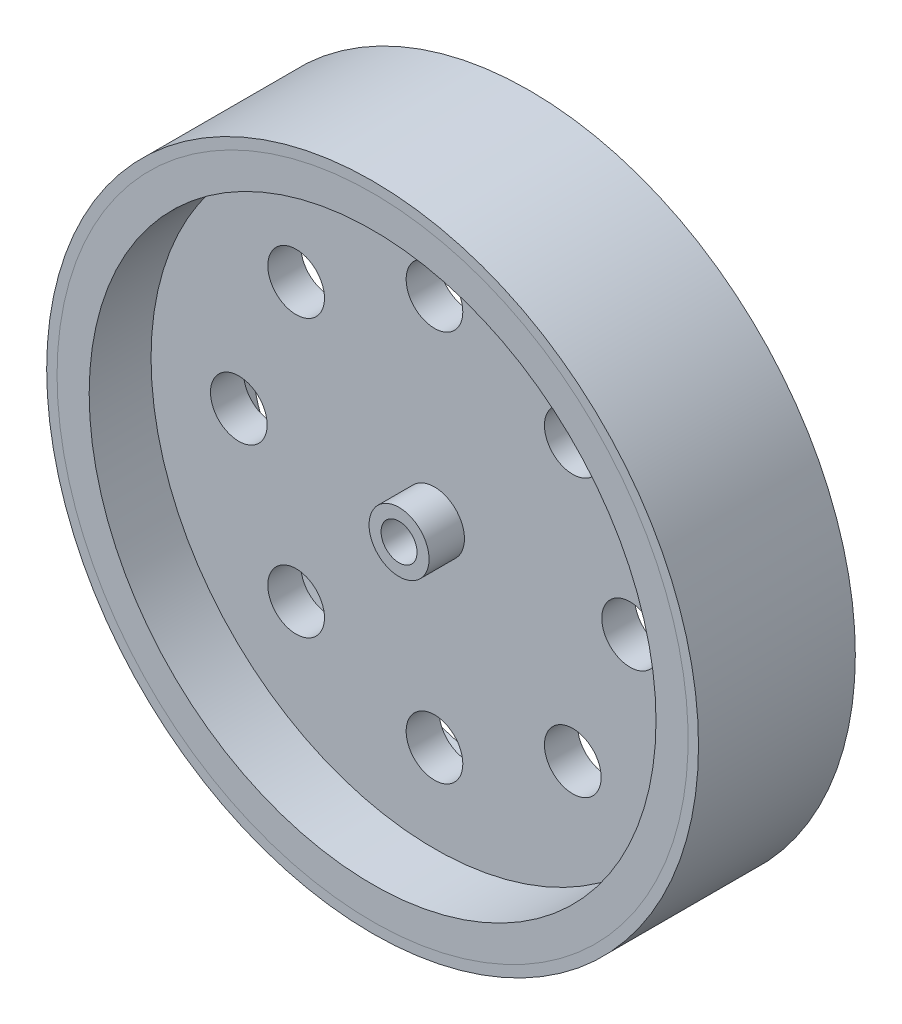
ISO-10303-21;
HEADER;
FILE_DESCRIPTION(('STEP AP214'),'2;1');
FILE_NAME('part.step','',(''),(''),'','','');
FILE_SCHEMA(('AUTOMOTIVE_DESIGN { 1 0 10303 214 1 1 1 1 }'));
ENDSEC;
DATA;
#1=APPLICATION_CONTEXT('core data for automotive mechanical design processes');
#2=APPLICATION_PROTOCOL_DEFINITION('international standard','automotive_design',2000,#1);
#3=PRODUCT_CONTEXT('',#1,'mechanical');
#4=PRODUCT('Part','Part','',(#3));
#5=PRODUCT_RELATED_PRODUCT_CATEGORY('part','',(#4));
#6=PRODUCT_DEFINITION_FORMATION('','',#4);
#7=PRODUCT_DEFINITION_CONTEXT('part definition',#1,'design');
#8=PRODUCT_DEFINITION('design','',#6,#7);
#9=PRODUCT_DEFINITION_SHAPE('','',#8);
#10=(LENGTH_UNIT() NAMED_UNIT(*) SI_UNIT(.MILLI.,.METRE.));
#11=(NAMED_UNIT(*) PLANE_ANGLE_UNIT() SI_UNIT($,.RADIAN.));
#12=(NAMED_UNIT(*) SI_UNIT($,.STERADIAN.) SOLID_ANGLE_UNIT());
#13=UNCERTAINTY_MEASURE_WITH_UNIT(LENGTH_MEASURE(1.E-05),#10,'distance_accuracy_value','');
#14=(GEOMETRIC_REPRESENTATION_CONTEXT(3) GLOBAL_UNCERTAINTY_ASSIGNED_CONTEXT((#13)) GLOBAL_UNIT_ASSIGNED_CONTEXT((#10,
#11,#12)) REPRESENTATION_CONTEXT('',''));
#15=CARTESIAN_POINT('',(0.,0.,0.));
#16=DIRECTION('',(0.,0.,1.));
#17=DIRECTION('',(1.,0.,0.));
#18=AXIS2_PLACEMENT_3D('',#15,#16,#17);
#19=CARTESIAN_POINT('',(0.,0.,1.05));
#20=DIRECTION('',(0.,0.,1.));
#21=DIRECTION('',(1.,0.,0.));
#22=AXIS2_PLACEMENT_3D('',#19,#20,#21);
#23=PLANE('',#22);
#24=CARTESIAN_POINT('',(0.,12.4255368501982,1.05));
#25=DIRECTION('',(0.,0.,1.));
#26=DIRECTION('',(1.,0.,0.));
#27=AXIS2_PLACEMENT_3D('',#24,#25,#26);
#28=CIRCLE('',#27,1.8);
#29=CARTESIAN_POINT('',(1.8,12.4255368501982,1.05));
#30=VERTEX_POINT('',#29);
#31=EDGE_CURVE('E84',#30,#30,#28,.T.);
#32=ORIENTED_EDGE('',*,*,#31,.F.);
#33=EDGE_LOOP('',(#32));
#34=FACE_BOUND('',#33,.T.);
#35=CARTESIAN_POINT('',(-8.78618136665871,8.786181366659,1.05));
#36=DIRECTION('',(0.,0.,1.));
#37=DIRECTION('',(1.,0.,0.));
#38=AXIS2_PLACEMENT_3D('',#35,#36,#37);
#39=CIRCLE('',#38,1.80000000000007);
#40=CARTESIAN_POINT('',(-6.98618136665864,8.786181366659,1.05));
#41=VERTEX_POINT('',#40);
#42=EDGE_CURVE('E88',#41,#41,#39,.T.);
#43=ORIENTED_EDGE('',*,*,#42,.F.);
#44=EDGE_LOOP('',(#43));
#45=FACE_BOUND('',#44,.T.);
#46=CARTESIAN_POINT('',(-12.4255368501989,7.04788306353095E-13,1.05));
#47=DIRECTION('',(0.,0.,1.));
#48=DIRECTION('',(1.,0.,0.));
#49=AXIS2_PLACEMENT_3D('',#46,#47,#48);
#50=CIRCLE('',#49,1.80000000000051);
#51=CARTESIAN_POINT('',(-10.6255368501984,7.04788306353095E-13,1.05));
#52=VERTEX_POINT('',#51);
#53=EDGE_CURVE('E92',#52,#52,#50,.T.);
#54=ORIENTED_EDGE('',*,*,#53,.F.);
#55=EDGE_LOOP('',(#54));
#56=FACE_BOUND('',#55,.T.);
#57=CARTESIAN_POINT('',(-8.78618136665971,-8.78618136665801,1.05));
#58=DIRECTION('',(0.,0.,1.));
#59=DIRECTION('',(1.,0.,0.));
#60=AXIS2_PLACEMENT_3D('',#57,#58,#59);
#61=CIRCLE('',#60,1.80000000000107);
#62=CARTESIAN_POINT('',(-6.98618136665864,-8.78618136665801,1.05));
#63=VERTEX_POINT('',#62);
#64=EDGE_CURVE('E96',#63,#63,#61,.T.);
#65=ORIENTED_EDGE('',*,*,#64,.F.);
#66=EDGE_LOOP('',(#65));
#67=FACE_BOUND('',#66,.T.);
#68=CARTESIAN_POINT('',(-1.40957661270619E-12,-12.4255368501982,1.05));
#69=DIRECTION('',(0.,0.,1.));
#70=DIRECTION('',(1.,0.,0.));
#71=AXIS2_PLACEMENT_3D('',#68,#69,#70);
#72=CIRCLE('',#71,1.80000000000143);
#73=CARTESIAN_POINT('',(1.80000000000002,-12.4255368501982,1.05));
#74=VERTEX_POINT('',#73);
#75=EDGE_CURVE('E100',#74,#74,#72,.T.);
#76=ORIENTED_EDGE('',*,*,#75,.F.);
#77=EDGE_LOOP('',(#76));
#78=FACE_BOUND('',#77,.T.);
#79=CARTESIAN_POINT('',(8.7861813666573,-8.78618136665901,1.05));
#80=DIRECTION('',(0.,0.,1.));
#81=DIRECTION('',(1.,0.,0.));
#82=AXIS2_PLACEMENT_3D('',#79,#80,#81);
#83=CIRCLE('',#82,1.8000000000014);
#84=CARTESIAN_POINT('',(10.5861813666587,-8.78618136665901,1.05));
#85=VERTEX_POINT('',#84);
#86=EDGE_CURVE('E104',#85,#85,#83,.T.);
#87=ORIENTED_EDGE('',*,*,#86,.F.);
#88=EDGE_LOOP('',(#87));
#89=FACE_BOUND('',#88,.T.);
#90=CARTESIAN_POINT('',(12.4255368501975,-7.06309995746223E-13,1.05));
#91=DIRECTION('',(0.,0.,1.));
#92=DIRECTION('',(1.,0.,0.));
#93=AXIS2_PLACEMENT_3D('',#90,#91,#92);
#94=CIRCLE('',#93,1.80000000000101);
#95=CARTESIAN_POINT('',(14.2255368501985,-7.06309995746223E-13,1.05));
#96=VERTEX_POINT('',#95);
#97=EDGE_CURVE('E108',#96,#96,#94,.T.);
#98=ORIENTED_EDGE('',*,*,#97,.F.);
#99=EDGE_LOOP('',(#98));
#100=FACE_BOUND('',#99,.T.);
#101=CARTESIAN_POINT('',(8.7861813666583,8.78618136665801,1.05));
#102=DIRECTION('',(0.,0.,1.));
#103=DIRECTION('',(1.,0.,0.));
#104=AXIS2_PLACEMENT_3D('',#101,#102,#103);
#105=CIRCLE('',#104,1.80000000000049);
#106=CARTESIAN_POINT('',(10.5861813666588,8.78618136665801,1.05));
#107=VERTEX_POINT('',#106);
#108=EDGE_CURVE('E112',#107,#107,#105,.T.);
#109=ORIENTED_EDGE('',*,*,#108,.F.);
#110=EDGE_LOOP('',(#109));
#111=FACE_BOUND('',#110,.T.);
#112=CARTESIAN_POINT('',(0.,0.,1.05));
#113=DIRECTION('',(0.,0.,1.));
#114=DIRECTION('',(1.,0.,0.));
#115=AXIS2_PLACEMENT_3D('',#112,#113,#114);
#116=CIRCLE('',#115,1.143);
#117=CARTESIAN_POINT('',(1.143,0.,1.05));
#118=VERTEX_POINT('',#117);
#119=EDGE_CURVE('E77',#118,#118,#116,.T.);
#120=ORIENTED_EDGE('',*,*,#119,.F.);
#121=EDGE_LOOP('',(#120));
#122=FACE_BOUND('',#121,.T.);
#123=CARTESIAN_POINT('',(0.,0.,1.05));
#124=DIRECTION('',(0.,0.,1.));
#125=DIRECTION('',(1.,0.,0.));
#126=AXIS2_PLACEMENT_3D('',#123,#124,#125);
#127=CIRCLE('',#126,18.);
#128=CARTESIAN_POINT('',(-18.,0.,1.05));
#129=VERTEX_POINT('',#128);
#130=EDGE_CURVE('E57',#129,#129,#127,.F.);
#131=ORIENTED_EDGE('',*,*,#130,.F.);
#132=EDGE_LOOP('',(#131));
#133=FACE_BOUND('',#132,.T.);
#134=ADVANCED_FACE('F48',(#34,#45,#56,#67,#78,#89,#100,#111,#122,#133),#23,.T.);
#135=CARTESIAN_POINT('',(0.,0.,4.98));
#136=DIRECTION('',(0.,0.,-1.));
#137=DIRECTION('',(-1.,0.,0.));
#138=AXIS2_PLACEMENT_3D('',#135,#136,#137);
#139=CYLINDRICAL_SURFACE('',#138,18.);
#140=CARTESIAN_POINT('',(0.,0.,-4.98));
#141=DIRECTION('',(0.,0.,1.));
#142=DIRECTION('',(1.,0.,0.));
#143=AXIS2_PLACEMENT_3D('',#140,#141,#142);
#144=CIRCLE('',#143,18.);
#145=CARTESIAN_POINT('',(-18.,0.,-4.98));
#146=VERTEX_POINT('',#145);
#147=EDGE_CURVE('E73',#146,#146,#144,.T.);
#148=CARTESIAN_POINT('',(0.,0.,-1.05));
#149=DIRECTION('',(0.,0.,1.));
#150=DIRECTION('',(1.,0.,0.));
#151=AXIS2_PLACEMENT_3D('',#148,#149,#150);
#152=CIRCLE('',#151,18.);
#153=CARTESIAN_POINT('',(-18.,0.,-1.05));
#154=VERTEX_POINT('',#153);
#155=EDGE_CURVE('E11',#154,#154,#152,.T.);
#156=CARTESIAN_POINT('',(-18.,0.,-4.98));
#157=CARTESIAN_POINT('',(-18.,0.,-4.9390625));
#158=CARTESIAN_POINT('',(-18.,0.,-4.898125));
#159=CARTESIAN_POINT('',(-18.,0.,-4.81625));
#160=CARTESIAN_POINT('',(-18.,0.,-4.7753125));
#161=CARTESIAN_POINT('',(-18.,0.,-4.6934375));
#162=CARTESIAN_POINT('',(-18.,0.,-4.6525));
#163=CARTESIAN_POINT('',(-18.,0.,-4.570625));
#164=CARTESIAN_POINT('',(-18.,0.,-4.5296875));
#165=CARTESIAN_POINT('',(-18.,0.,-4.4478125));
#166=CARTESIAN_POINT('',(-18.,0.,-4.406875));
#167=CARTESIAN_POINT('',(-18.,0.,-4.325));
#168=CARTESIAN_POINT('',(-18.,0.,-4.2840625));
#169=CARTESIAN_POINT('',(-18.,0.,-4.2021875));
#170=CARTESIAN_POINT('',(-18.,0.,-4.16125));
#171=CARTESIAN_POINT('',(-18.,0.,-4.079375));
#172=CARTESIAN_POINT('',(-18.,0.,-4.0384375));
#173=CARTESIAN_POINT('',(-18.,0.,-3.9565625));
#174=CARTESIAN_POINT('',(-18.,0.,-3.915625));
#175=CARTESIAN_POINT('',(-18.,0.,-3.83375));
#176=CARTESIAN_POINT('',(-18.,0.,-3.7928125));
#177=CARTESIAN_POINT('',(-18.,0.,-3.7109375));
#178=CARTESIAN_POINT('',(-18.,0.,-3.67));
#179=CARTESIAN_POINT('',(-18.,0.,-3.588125));
#180=CARTESIAN_POINT('',(-18.,0.,-3.5471875));
#181=CARTESIAN_POINT('',(-18.,0.,-3.4653125));
#182=CARTESIAN_POINT('',(-18.,0.,-3.424375));
#183=CARTESIAN_POINT('',(-18.,0.,-3.3425));
#184=CARTESIAN_POINT('',(-18.,0.,-3.3015625));
#185=CARTESIAN_POINT('',(-18.,0.,-3.2196875));
#186=CARTESIAN_POINT('',(-18.,0.,-3.17875));
#187=CARTESIAN_POINT('',(-18.,0.,-3.096875));
#188=CARTESIAN_POINT('',(-18.,0.,-3.0559375));
#189=CARTESIAN_POINT('',(-18.,0.,-2.9740625));
#190=CARTESIAN_POINT('',(-18.,0.,-2.933125));
#191=CARTESIAN_POINT('',(-18.,0.,-2.85125));
#192=CARTESIAN_POINT('',(-18.,0.,-2.8103125));
#193=CARTESIAN_POINT('',(-18.,0.,-2.7284375));
#194=CARTESIAN_POINT('',(-18.,0.,-2.6875));
#195=CARTESIAN_POINT('',(-18.,0.,-2.605625));
#196=CARTESIAN_POINT('',(-18.,0.,-2.5646875));
#197=CARTESIAN_POINT('',(-18.,0.,-2.4828125));
#198=CARTESIAN_POINT('',(-18.,0.,-2.441875));
#199=CARTESIAN_POINT('',(-18.,0.,-2.36));
#200=CARTESIAN_POINT('',(-18.,0.,-2.3190625));
#201=CARTESIAN_POINT('',(-18.,0.,-2.2371875));
#202=CARTESIAN_POINT('',(-18.,0.,-2.19625));
#203=CARTESIAN_POINT('',(-18.,0.,-2.114375));
#204=CARTESIAN_POINT('',(-18.,0.,-2.0734375));
#205=CARTESIAN_POINT('',(-18.,0.,-1.9915625));
#206=CARTESIAN_POINT('',(-18.,0.,-1.950625));
#207=CARTESIAN_POINT('',(-18.,0.,-1.86875));
#208=CARTESIAN_POINT('',(-18.,0.,-1.8278125));
#209=CARTESIAN_POINT('',(-18.,0.,-1.7459375));
#210=CARTESIAN_POINT('',(-18.,0.,-1.705));
#211=CARTESIAN_POINT('',(-18.,0.,-1.623125));
#212=CARTESIAN_POINT('',(-18.,0.,-1.5821875));
#213=CARTESIAN_POINT('',(-18.,0.,-1.5003125));
#214=CARTESIAN_POINT('',(-18.,0.,-1.459375));
#215=CARTESIAN_POINT('',(-18.,0.,-1.3775));
#216=CARTESIAN_POINT('',(-18.,0.,-1.3365625));
#217=CARTESIAN_POINT('',(-18.,0.,-1.2546875));
#218=CARTESIAN_POINT('',(-18.,0.,-1.21375));
#219=CARTESIAN_POINT('',(-18.,0.,-1.131875));
#220=CARTESIAN_POINT('',(-18.,0.,-1.0909375));
#221=CARTESIAN_POINT('',(-18.,0.,-1.05));
#222=B_SPLINE_CURVE_WITH_KNOTS('',3,(#156,#157,#158,#159,#160,#161,#162,#163,#164,#165,#166,
#167,#168,#169,#170,#171,#172,#173,#174,#175,#176,#177,#178,#179,#180,#181,#182,#183,#184,#185,
#186,#187,#188,#189,#190,#191,#192,#193,#194,#195,#196,#197,#198,#199,#200,#201,#202,#203,#204,
#205,#206,#207,#208,#209,#210,#211,#212,#213,#214,#215,#216,#217,#218,#219,#220,#221),
.UNSPECIFIED.,.F.,.F.,(4,2,2,2,2,2,2,2,2,2,2,2,2,2,2,2,2,2,2,2,2,2,2,2,2,2,2,2,2,2,2,2,4),(0.,
0.1228125,0.245624999999999,0.368437500000001,0.49125,0.6140625,0.736875000000001,
0.859687500000001,0.982500000000001,1.1053125,1.228125,1.3509375,1.47375,1.5965625,1.719375,
1.8421875,1.965,2.0878125,2.210625,2.3334375,2.45625,2.5790625,2.701875,2.8246875,2.9475,
3.0703125,3.193125,3.3159375,3.43875,3.5615625,3.684375,3.8071875,3.93),.UNSPECIFIED.);
#223=EDGE_CURVE('BSEAM186',#146,#154,#222,.T.);
#224=ORIENTED_EDGE('',*,*,#147,.F.);
#225=ORIENTED_EDGE('',*,*,#155,.T.);
#226=ORIENTED_EDGE('',*,*,#223,.T.);
#227=ORIENTED_EDGE('',*,*,#223,.F.);
#228=EDGE_LOOP('',(#224,#226,#225,#227));
#229=FACE_BOUND('',#228,.T.);
#230=ADVANCED_FACE('F186',(#229),#139,.F.);
#231=CARTESIAN_POINT('',(0.,0.,4.98));
#232=DIRECTION('',(0.,0.,1.));
#233=DIRECTION('',(1.,0.,0.));
#234=AXIS2_PLACEMENT_3D('',#231,#232,#233);
#235=PLANE('',#234);
#236=CARTESIAN_POINT('',(0.,0.,4.98));
#237=DIRECTION('',(0.,0.,1.));
#238=DIRECTION('',(1.,0.,0.));
#239=AXIS2_PLACEMENT_3D('',#236,#237,#238);
#240=CIRCLE('',#239,20.04);
#241=CARTESIAN_POINT('',(-20.04,0.,4.98));
#242=VERTEX_POINT('',#241);
#243=EDGE_CURVE('E62',#242,#242,#240,.T.);
#244=ORIENTED_EDGE('',*,*,#243,.T.);
#245=EDGE_LOOP('',(#244));
#246=FACE_BOUND('',#245,.T.);
#247=CARTESIAN_POINT('',(0.,0.,4.98));
#248=DIRECTION('',(0.,0.,1.));
#249=DIRECTION('',(1.,0.,0.));
#250=AXIS2_PLACEMENT_3D('',#247,#248,#249);
#251=CIRCLE('',#250,18.);
#252=CARTESIAN_POINT('',(-18.,0.,4.98));
#253=VERTEX_POINT('',#252);
#254=EDGE_CURVE('E69',#253,#253,#251,.T.);
#255=ORIENTED_EDGE('',*,*,#254,.F.);
#256=EDGE_LOOP('',(#255));
#257=FACE_BOUND('',#256,.T.);
#258=ADVANCED_FACE('F191',(#246,#257),#235,.T.);
#259=CARTESIAN_POINT('',(0.,0.,-4.98));
#260=DIRECTION('',(0.,0.,1.));
#261=DIRECTION('',(1.,0.,0.));
#262=AXIS2_PLACEMENT_3D('',#259,#260,#261);
#263=PLANE('',#262);
#264=CARTESIAN_POINT('',(0.,0.,-4.98));
#265=DIRECTION('',(0.,0.,1.));
#266=DIRECTION('',(1.,0.,0.));
#267=AXIS2_PLACEMENT_3D('',#264,#265,#266);
#268=CIRCLE('',#267,20.04);
#269=CARTESIAN_POINT('',(-20.04,0.,-4.98));
#270=VERTEX_POINT('',#269);
#271=EDGE_CURVE('E65',#270,#270,#268,.T.);
#272=ORIENTED_EDGE('',*,*,#271,.F.);
#273=EDGE_LOOP('',(#272));
#274=FACE_BOUND('',#273,.T.);
#275=ORIENTED_EDGE('',*,*,#147,.T.);
#276=EDGE_LOOP('',(#275));
#277=FACE_BOUND('',#276,.T.);
#278=ADVANCED_FACE('F199',(#274,#277),#263,.F.);
#279=CARTESIAN_POINT('',(0.,0.,4.98));
#280=DIRECTION('',(0.,0.,-1.));
#281=DIRECTION('',(-1.,0.,0.));
#282=AXIS2_PLACEMENT_3D('',#279,#280,#281);
#283=CYLINDRICAL_SURFACE('',#282,20.04);
#284=CARTESIAN_POINT('',(-20.04,0.,4.98));
#285=CARTESIAN_POINT('',(-20.04,0.,4.87625));
#286=CARTESIAN_POINT('',(-20.04,0.,4.7725));
#287=CARTESIAN_POINT('',(-20.04,0.,4.565));
#288=CARTESIAN_POINT('',(-20.04,0.,4.46125));
#289=CARTESIAN_POINT('',(-20.04,0.,4.25375));
#290=CARTESIAN_POINT('',(-20.04,0.,4.15));
#291=CARTESIAN_POINT('',(-20.04,0.,3.9425));
#292=CARTESIAN_POINT('',(-20.04,0.,3.83875));
#293=CARTESIAN_POINT('',(-20.04,0.,3.63125));
#294=CARTESIAN_POINT('',(-20.04,0.,3.5275));
#295=CARTESIAN_POINT('',(-20.04,0.,3.32));
#296=CARTESIAN_POINT('',(-20.04,0.,3.21625));
#297=CARTESIAN_POINT('',(-20.04,0.,3.00875));
#298=CARTESIAN_POINT('',(-20.04,0.,2.905));
#299=CARTESIAN_POINT('',(-20.04,0.,2.6975));
#300=CARTESIAN_POINT('',(-20.04,0.,2.59375));
#301=CARTESIAN_POINT('',(-20.04,0.,2.38625));
#302=CARTESIAN_POINT('',(-20.04,0.,2.2825));
#303=CARTESIAN_POINT('',(-20.04,0.,2.075));
#304=CARTESIAN_POINT('',(-20.04,0.,1.97125));
#305=CARTESIAN_POINT('',(-20.04,0.,1.76375));
#306=CARTESIAN_POINT('',(-20.04,0.,1.66));
#307=CARTESIAN_POINT('',(-20.04,0.,1.4525));
#308=CARTESIAN_POINT('',(-20.04,0.,1.34875));
#309=CARTESIAN_POINT('',(-20.04,0.,1.14125));
#310=CARTESIAN_POINT('',(-20.04,0.,1.0375));
#311=CARTESIAN_POINT('',(-20.04,0.,0.829999999999999));
#312=CARTESIAN_POINT('',(-20.04,0.,0.726249999999998));
#313=CARTESIAN_POINT('',(-20.04,0.,0.518749999999998));
#314=CARTESIAN_POINT('',(-20.04,0.,0.414999999999998));
#315=CARTESIAN_POINT('',(-20.04,0.,0.207499999999998));
#316=CARTESIAN_POINT('',(-20.04,0.,0.103749999999998));
#317=CARTESIAN_POINT('',(-20.04,0.,-0.103750000000002));
#318=CARTESIAN_POINT('',(-20.04,0.,-0.207500000000002));
#319=CARTESIAN_POINT('',(-20.04,0.,-0.415000000000002));
#320=CARTESIAN_POINT('',(-20.04,0.,-0.518750000000001));
#321=CARTESIAN_POINT('',(-20.04,0.,-0.726250000000002));
#322=CARTESIAN_POINT('',(-20.04,0.,-0.830000000000002));
#323=CARTESIAN_POINT('',(-20.04,0.,-1.0375));
#324=CARTESIAN_POINT('',(-20.04,0.,-1.14125));
#325=CARTESIAN_POINT('',(-20.04,0.,-1.34875));
#326=CARTESIAN_POINT('',(-20.04,0.,-1.4525));
#327=CARTESIAN_POINT('',(-20.04,0.,-1.66));
#328=CARTESIAN_POINT('',(-20.04,0.,-1.76375));
#329=CARTESIAN_POINT('',(-20.04,0.,-1.97125));
#330=CARTESIAN_POINT('',(-20.04,0.,-2.075));
#331=CARTESIAN_POINT('',(-20.04,0.,-2.2825));
#332=CARTESIAN_POINT('',(-20.04,0.,-2.38625));
#333=CARTESIAN_POINT('',(-20.04,0.,-2.59375));
#334=CARTESIAN_POINT('',(-20.04,0.,-2.6975));
#335=CARTESIAN_POINT('',(-20.04,0.,-2.905));
#336=CARTESIAN_POINT('',(-20.04,0.,-3.00875));
#337=CARTESIAN_POINT('',(-20.04,0.,-3.21625));
#338=CARTESIAN_POINT('',(-20.04,0.,-3.32));
#339=CARTESIAN_POINT('',(-20.04,0.,-3.5275));
#340=CARTESIAN_POINT('',(-20.04,0.,-3.63125));
#341=CARTESIAN_POINT('',(-20.04,0.,-3.83875));
#342=CARTESIAN_POINT('',(-20.04,0.,-3.9425));
#343=CARTESIAN_POINT('',(-20.04,0.,-4.15));
#344=CARTESIAN_POINT('',(-20.04,0.,-4.25375));
#345=CARTESIAN_POINT('',(-20.04,0.,-4.46125));
#346=CARTESIAN_POINT('',(-20.04,0.,-4.565));
#347=CARTESIAN_POINT('',(-20.04,0.,-4.7725));
#348=CARTESIAN_POINT('',(-20.04,0.,-4.87625));
#349=CARTESIAN_POINT('',(-20.04,0.,-4.98));
#350=B_SPLINE_CURVE_WITH_KNOTS('',3,(#284,#285,#286,#287,#288,#289,#290,#291,#292,#293,#294,
#295,#296,#297,#298,#299,#300,#301,#302,#303,#304,#305,#306,#307,#308,#309,#310,#311,#312,#313,
#314,#315,#316,#317,#318,#319,#320,#321,#322,#323,#324,#325,#326,#327,#328,#329,#330,#331,#332,
#333,#334,#335,#336,#337,#338,#339,#340,#341,#342,#343,#344,#345,#346,#347,#348,#349),
.UNSPECIFIED.,.F.,.F.,(4,2,2,2,2,2,2,2,2,2,2,2,2,2,2,2,2,2,2,2,2,2,2,2,2,2,2,2,2,2,2,2,4),(0.,
0.31125,0.6225,0.93375,1.245,1.55625,1.8675,2.17875,2.49,2.80125,3.1125,3.42375,3.735,4.04625,
4.3575,4.66875,4.98,5.29125,5.6025,5.91375,6.225,6.53625,6.8475,7.15875,7.47,7.78125,8.0925,
8.40375,8.715,9.02625,9.3375,9.64875,9.96),.UNSPECIFIED.);
#351=EDGE_CURVE('BSEAM196',#242,#270,#350,.T.);
#352=ORIENTED_EDGE('',*,*,#243,.F.);
#353=ORIENTED_EDGE('',*,*,#271,.T.);
#354=ORIENTED_EDGE('',*,*,#351,.T.);
#355=ORIENTED_EDGE('',*,*,#351,.F.);
#356=EDGE_LOOP('',(#352,#354,#353,#355));
#357=FACE_BOUND('',#356,.T.);
#358=ADVANCED_FACE('F196',(#357),#283,.T.);
#359=CARTESIAN_POINT('',(-18.,0.,1.05));
#360=CARTESIAN_POINT('',(-18.,0.,1.0909375));
#361=CARTESIAN_POINT('',(-18.,0.,1.131875));
#362=CARTESIAN_POINT('',(-18.,0.,1.21375));
#363=CARTESIAN_POINT('',(-18.,0.,1.2546875));
#364=CARTESIAN_POINT('',(-18.,0.,1.3365625));
#365=CARTESIAN_POINT('',(-18.,0.,1.3775));
#366=CARTESIAN_POINT('',(-18.,0.,1.459375));
#367=CARTESIAN_POINT('',(-18.,0.,1.5003125));
#368=CARTESIAN_POINT('',(-18.,0.,1.5821875));
#369=CARTESIAN_POINT('',(-18.,0.,1.623125));
#370=CARTESIAN_POINT('',(-18.,0.,1.705));
#371=CARTESIAN_POINT('',(-18.,0.,1.7459375));
#372=CARTESIAN_POINT('',(-18.,0.,1.8278125));
#373=CARTESIAN_POINT('',(-18.,0.,1.86875));
#374=CARTESIAN_POINT('',(-18.,0.,1.950625));
#375=CARTESIAN_POINT('',(-18.,0.,1.9915625));
#376=CARTESIAN_POINT('',(-18.,0.,2.0734375));
#377=CARTESIAN_POINT('',(-18.,0.,2.114375));
#378=CARTESIAN_POINT('',(-18.,0.,2.19625));
#379=CARTESIAN_POINT('',(-18.,0.,2.2371875));
#380=CARTESIAN_POINT('',(-18.,0.,2.3190625));
#381=CARTESIAN_POINT('',(-18.,0.,2.36));
#382=CARTESIAN_POINT('',(-18.,0.,2.441875));
#383=CARTESIAN_POINT('',(-18.,0.,2.4828125));
#384=CARTESIAN_POINT('',(-18.,0.,2.5646875));
#385=CARTESIAN_POINT('',(-18.,0.,2.605625));
#386=CARTESIAN_POINT('',(-18.,0.,2.6875));
#387=CARTESIAN_POINT('',(-18.,0.,2.7284375));
#388=CARTESIAN_POINT('',(-18.,0.,2.8103125));
#389=CARTESIAN_POINT('',(-18.,0.,2.85125));
#390=CARTESIAN_POINT('',(-18.,0.,2.933125));
#391=CARTESIAN_POINT('',(-18.,0.,2.9740625));
#392=CARTESIAN_POINT('',(-18.,0.,3.0559375));
#393=CARTESIAN_POINT('',(-18.,0.,3.096875));
#394=CARTESIAN_POINT('',(-18.,0.,3.17875));
#395=CARTESIAN_POINT('',(-18.,0.,3.2196875));
#396=CARTESIAN_POINT('',(-18.,0.,3.3015625));
#397=CARTESIAN_POINT('',(-18.,0.,3.3425));
#398=CARTESIAN_POINT('',(-18.,0.,3.424375));
#399=CARTESIAN_POINT('',(-18.,0.,3.4653125));
#400=CARTESIAN_POINT('',(-18.,0.,3.5471875));
#401=CARTESIAN_POINT('',(-18.,0.,3.588125));
#402=CARTESIAN_POINT('',(-18.,0.,3.67));
#403=CARTESIAN_POINT('',(-18.,0.,3.7109375));
#404=CARTESIAN_POINT('',(-18.,0.,3.7928125));
#405=CARTESIAN_POINT('',(-18.,0.,3.83375));
#406=CARTESIAN_POINT('',(-18.,0.,3.915625));
#407=CARTESIAN_POINT('',(-18.,0.,3.9565625));
#408=CARTESIAN_POINT('',(-18.,0.,4.0384375));
#409=CARTESIAN_POINT('',(-18.,0.,4.079375));
#410=CARTESIAN_POINT('',(-18.,0.,4.16125));
#411=CARTESIAN_POINT('',(-18.,0.,4.2021875));
#412=CARTESIAN_POINT('',(-18.,0.,4.2840625));
#413=CARTESIAN_POINT('',(-18.,0.,4.325));
#414=CARTESIAN_POINT('',(-18.,0.,4.406875));
#415=CARTESIAN_POINT('',(-18.,0.,4.4478125));
#416=CARTESIAN_POINT('',(-18.,0.,4.5296875));
#417=CARTESIAN_POINT('',(-18.,0.,4.570625));
#418=CARTESIAN_POINT('',(-18.,0.,4.6525));
#419=CARTESIAN_POINT('',(-18.,0.,4.6934375));
#420=CARTESIAN_POINT('',(-18.,0.,4.7753125));
#421=CARTESIAN_POINT('',(-18.,0.,4.81625));
#422=CARTESIAN_POINT('',(-18.,0.,4.898125));
#423=CARTESIAN_POINT('',(-18.,0.,4.9390625));
#424=CARTESIAN_POINT('',(-18.,0.,4.98));
#425=B_SPLINE_CURVE_WITH_KNOTS('',3,(#359,#360,#361,#362,#363,#364,#365,#366,#367,#368,#369,
#370,#371,#372,#373,#374,#375,#376,#377,#378,#379,#380,#381,#382,#383,#384,#385,#386,#387,#388,
#389,#390,#391,#392,#393,#394,#395,#396,#397,#398,#399,#400,#401,#402,#403,#404,#405,#406,#407,
#408,#409,#410,#411,#412,#413,#414,#415,#416,#417,#418,#419,#420,#421,#422,#423,#424),
.UNSPECIFIED.,.F.,.F.,(4,2,2,2,2,2,2,2,2,2,2,2,2,2,2,2,2,2,2,2,2,2,2,2,2,2,2,2,2,2,2,2,4),(0.,
0.1228125,0.245625,0.368437499999999,0.49125,0.6140625,0.736875,0.8596875,0.982499999999999,
1.1053125,1.228125,1.3509375,1.47375,1.5965625,1.719375,1.8421875,1.965,2.0878125,2.210625,
2.3334375,2.45625,2.5790625,2.701875,2.8246875,2.9475,3.0703125,3.193125,3.3159375,3.43875,
3.5615625,3.684375,3.8071875,3.93),.UNSPECIFIED.);
#426=EDGE_CURVE('BSEAM154',#129,#253,#425,.T.);
#427=ORIENTED_EDGE('',*,*,#130,.T.);
#428=ORIENTED_EDGE('',*,*,#254,.T.);
#429=ORIENTED_EDGE('',*,*,#426,.T.);
#430=ORIENTED_EDGE('',*,*,#426,.F.);
#431=EDGE_LOOP('',(#427,#429,#428,#430));
#432=FACE_BOUND('',#431,.T.);
#433=ADVANCED_FACE('F154',(#432),#139,.F.);
#434=CARTESIAN_POINT('',(0.,0.,-1.05));
#435=DIRECTION('',(0.,0.,1.));
#436=DIRECTION('',(1.,0.,0.));
#437=AXIS2_PLACEMENT_3D('',#434,#435,#436);
#438=PLANE('',#437);
#439=CARTESIAN_POINT('',(0.,12.4255368501982,-1.05));
#440=DIRECTION('',(0.,0.,-1.));
#441=DIRECTION('',(-1.,0.,0.));
#442=AXIS2_PLACEMENT_3D('',#439,#440,#441);
#443=CIRCLE('',#442,1.8);
#444=CARTESIAN_POINT('',(-1.8,12.4255368501982,-1.05));
#445=VERTEX_POINT('',#444);
#446=EDGE_CURVE('E116',#445,#445,#443,.T.);
#447=ORIENTED_EDGE('',*,*,#446,.F.);
#448=EDGE_LOOP('',(#447));
#449=FACE_BOUND('',#448,.T.);
#450=CARTESIAN_POINT('',(-8.78618136665871,8.786181366659,-1.05));
#451=DIRECTION('',(0.,0.,-1.));
#452=DIRECTION('',(-1.,0.,0.));
#453=AXIS2_PLACEMENT_3D('',#450,#451,#452);
#454=CIRCLE('',#453,1.80000000000007);
#455=CARTESIAN_POINT('',(-10.5861813666588,8.786181366659,-1.05));
#456=VERTEX_POINT('',#455);
#457=EDGE_CURVE('E141',#456,#456,#454,.T.);
#458=ORIENTED_EDGE('',*,*,#457,.F.);
#459=EDGE_LOOP('',(#458));
#460=FACE_BOUND('',#459,.T.);
#461=CARTESIAN_POINT('',(-12.4255368501989,7.04788306353095E-13,-1.05));
#462=DIRECTION('',(0.,0.,-1.));
#463=DIRECTION('',(-1.,0.,0.));
#464=AXIS2_PLACEMENT_3D('',#461,#462,#463);
#465=CIRCLE('',#464,1.80000000000051);
#466=CARTESIAN_POINT('',(-14.2255368501994,7.04788306353095E-13,-1.05));
#467=VERTEX_POINT('',#466);
#468=EDGE_CURVE('E137',#467,#467,#465,.T.);
#469=ORIENTED_EDGE('',*,*,#468,.F.);
#470=EDGE_LOOP('',(#469));
#471=FACE_BOUND('',#470,.T.);
#472=CARTESIAN_POINT('',(-8.78618136665971,-8.78618136665801,-1.05));
#473=DIRECTION('',(0.,0.,-1.));
#474=DIRECTION('',(-1.,0.,0.));
#475=AXIS2_PLACEMENT_3D('',#472,#473,#474);
#476=CIRCLE('',#475,1.80000000000107);
#477=CARTESIAN_POINT('',(-10.5861813666608,-8.78618136665801,-1.05));
#478=VERTEX_POINT('',#477);
#479=EDGE_CURVE('E133',#478,#478,#476,.T.);
#480=ORIENTED_EDGE('',*,*,#479,.F.);
#481=EDGE_LOOP('',(#480));
#482=FACE_BOUND('',#481,.T.);
#483=CARTESIAN_POINT('',(-1.40957661270619E-12,-12.4255368501982,-1.05));
#484=DIRECTION('',(0.,0.,-1.));
#485=DIRECTION('',(-1.,0.,0.));
#486=AXIS2_PLACEMENT_3D('',#483,#484,#485);
#487=CIRCLE('',#486,1.80000000000143);
#488=CARTESIAN_POINT('',(-1.80000000000284,-12.4255368501982,-1.05));
#489=VERTEX_POINT('',#488);
#490=EDGE_CURVE('E129',#489,#489,#487,.T.);
#491=ORIENTED_EDGE('',*,*,#490,.F.);
#492=EDGE_LOOP('',(#491));
#493=FACE_BOUND('',#492,.T.);
#494=CARTESIAN_POINT('',(8.7861813666573,-8.78618136665901,-1.05));
#495=DIRECTION('',(0.,0.,-1.));
#496=DIRECTION('',(-1.,0.,0.));
#497=AXIS2_PLACEMENT_3D('',#494,#495,#496);
#498=CIRCLE('',#497,1.8000000000014);
#499=CARTESIAN_POINT('',(6.9861813666559,-8.78618136665901,-1.05));
#500=VERTEX_POINT('',#499);
#501=EDGE_CURVE('E125',#500,#500,#498,.T.);
#502=ORIENTED_EDGE('',*,*,#501,.F.);
#503=EDGE_LOOP('',(#502));
#504=FACE_BOUND('',#503,.T.);
#505=CARTESIAN_POINT('',(12.4255368501975,-7.06309995746223E-13,-1.05));
#506=DIRECTION('',(0.,0.,-1.));
#507=DIRECTION('',(-1.,0.,0.));
#508=AXIS2_PLACEMENT_3D('',#505,#506,#507);
#509=CIRCLE('',#508,1.80000000000101);
#510=CARTESIAN_POINT('',(10.6255368501965,-7.06309995746223E-13,-1.05));
#511=VERTEX_POINT('',#510);
#512=EDGE_CURVE('E121',#511,#511,#509,.T.);
#513=ORIENTED_EDGE('',*,*,#512,.F.);
#514=EDGE_LOOP('',(#513));
#515=FACE_BOUND('',#514,.T.);
#516=CARTESIAN_POINT('',(8.7861813666583,8.78618136665801,-1.05));
#517=DIRECTION('',(0.,0.,-1.));
#518=DIRECTION('',(-1.,0.,0.));
#519=AXIS2_PLACEMENT_3D('',#516,#517,#518);
#520=CIRCLE('',#519,1.80000000000049);
#521=CARTESIAN_POINT('',(6.98618136665781,8.78618136665801,-1.05));
#522=VERTEX_POINT('',#521);
#523=EDGE_CURVE('E117',#522,#522,#520,.T.);
#524=ORIENTED_EDGE('',*,*,#523,.F.);
#525=EDGE_LOOP('',(#524));
#526=FACE_BOUND('',#525,.T.);
#527=CARTESIAN_POINT('',(0.,0.,-1.05));
#528=DIRECTION('',(0.,0.,1.));
#529=DIRECTION('',(1.,0.,0.));
#530=AXIS2_PLACEMENT_3D('',#527,#528,#529);
#531=CIRCLE('',#530,1.143);
#532=CARTESIAN_POINT('',(1.143,0.,-1.05));
#533=VERTEX_POINT('',#532);
#534=EDGE_CURVE('E52',#533,#533,#531,.T.);
#535=ORIENTED_EDGE('',*,*,#534,.T.);
#536=EDGE_LOOP('',(#535));
#537=FACE_BOUND('',#536,.T.);
#538=ORIENTED_EDGE('',*,*,#155,.F.);
#539=EDGE_LOOP('',(#538));
#540=FACE_BOUND('',#539,.T.);
#541=ADVANCED_FACE('F50',(#449,#460,#471,#482,#493,#504,#515,#526,#537,#540),#438,.F.);
#542=CARTESIAN_POINT('',(0.,0.,-10.02));
#543=DIRECTION('',(0.,0.,1.));
#544=DIRECTION('',(1.,0.,0.));
#545=AXIS2_PLACEMENT_3D('',#542,#543,#544);
#546=CYLINDRICAL_SURFACE('',#545,1.143);
#547=ORIENTED_EDGE('',*,*,#119,.T.);
#548=EDGE_LOOP('',(#547));
#549=FACE_BOUND('',#548,.T.);
#550=ORIENTED_EDGE('',*,*,#534,.F.);
#551=EDGE_LOOP('',(#550));
#552=FACE_BOUND('',#551,.T.);
#553=ADVANCED_FACE('F153',(#549,#552),#546,.F.);
#554=CARTESIAN_POINT('',(8.7861813666583,8.78618136665801,4.98));
#555=DIRECTION('',(0.,0.,-1.));
#556=DIRECTION('',(-1.,0.,0.));
#557=AXIS2_PLACEMENT_3D('',#554,#555,#556);
#558=CYLINDRICAL_SURFACE('',#557,1.80000000000049);
#559=ORIENTED_EDGE('',*,*,#108,.T.);
#560=EDGE_LOOP('',(#559));
#561=FACE_BOUND('',#560,.T.);
#562=ORIENTED_EDGE('',*,*,#523,.T.);
#563=EDGE_LOOP('',(#562));
#564=FACE_BOUND('',#563,.T.);
#565=ADVANCED_FACE('F175',(#561,#564),#558,.F.);
#566=CARTESIAN_POINT('',(12.4255368501975,-7.06309995746223E-13,4.98));
#567=DIRECTION('',(0.,0.,-1.));
#568=DIRECTION('',(-1.,0.,0.));
#569=AXIS2_PLACEMENT_3D('',#566,#567,#568);
#570=CYLINDRICAL_SURFACE('',#569,1.80000000000101);
#571=ORIENTED_EDGE('',*,*,#97,.T.);
#572=EDGE_LOOP('',(#571));
#573=FACE_BOUND('',#572,.T.);
#574=ORIENTED_EDGE('',*,*,#512,.T.);
#575=EDGE_LOOP('',(#574));
#576=FACE_BOUND('',#575,.T.);
#577=ADVANCED_FACE('F181',(#573,#576),#570,.F.);
#578=CARTESIAN_POINT('',(8.7861813666573,-8.78618136665901,4.98));
#579=DIRECTION('',(0.,0.,-1.));
#580=DIRECTION('',(-1.,0.,0.));
#581=AXIS2_PLACEMENT_3D('',#578,#579,#580);
#582=CYLINDRICAL_SURFACE('',#581,1.8000000000014);
#583=ORIENTED_EDGE('',*,*,#86,.T.);
#584=EDGE_LOOP('',(#583));
#585=FACE_BOUND('',#584,.T.);
#586=ORIENTED_EDGE('',*,*,#501,.T.);
#587=EDGE_LOOP('',(#586));
#588=FACE_BOUND('',#587,.T.);
#589=ADVANCED_FACE('F241',(#585,#588),#582,.F.);
#590=CARTESIAN_POINT('',(-1.40957661270619E-12,-12.4255368501982,4.98));
#591=DIRECTION('',(0.,0.,-1.));
#592=DIRECTION('',(-1.,0.,0.));
#593=AXIS2_PLACEMENT_3D('',#590,#591,#592);
#594=CYLINDRICAL_SURFACE('',#593,1.80000000000143);
#595=ORIENTED_EDGE('',*,*,#75,.T.);
#596=EDGE_LOOP('',(#595));
#597=FACE_BOUND('',#596,.T.);
#598=ORIENTED_EDGE('',*,*,#490,.T.);
#599=EDGE_LOOP('',(#598));
#600=FACE_BOUND('',#599,.T.);
#601=ADVANCED_FACE('F251',(#597,#600),#594,.F.);
#602=CARTESIAN_POINT('',(-8.78618136665971,-8.78618136665801,4.98));
#603=DIRECTION('',(0.,0.,-1.));
#604=DIRECTION('',(-1.,0.,0.));
#605=AXIS2_PLACEMENT_3D('',#602,#603,#604);
#606=CYLINDRICAL_SURFACE('',#605,1.80000000000107);
#607=ORIENTED_EDGE('',*,*,#64,.T.);
#608=EDGE_LOOP('',(#607));
#609=FACE_BOUND('',#608,.T.);
#610=ORIENTED_EDGE('',*,*,#479,.T.);
#611=EDGE_LOOP('',(#610));
#612=FACE_BOUND('',#611,.T.);
#613=ADVANCED_FACE('F261',(#609,#612),#606,.F.);
#614=CARTESIAN_POINT('',(-12.4255368501989,7.04788306353095E-13,4.98));
#615=DIRECTION('',(0.,0.,-1.));
#616=DIRECTION('',(-1.,0.,0.));
#617=AXIS2_PLACEMENT_3D('',#614,#615,#616);
#618=CYLINDRICAL_SURFACE('',#617,1.80000000000051);
#619=ORIENTED_EDGE('',*,*,#53,.T.);
#620=EDGE_LOOP('',(#619));
#621=FACE_BOUND('',#620,.T.);
#622=ORIENTED_EDGE('',*,*,#468,.T.);
#623=EDGE_LOOP('',(#622));
#624=FACE_BOUND('',#623,.T.);
#625=ADVANCED_FACE('F271',(#621,#624),#618,.F.);
#626=CARTESIAN_POINT('',(-8.78618136665871,8.786181366659,4.98));
#627=DIRECTION('',(0.,0.,-1.));
#628=DIRECTION('',(-1.,0.,0.));
#629=AXIS2_PLACEMENT_3D('',#626,#627,#628);
#630=CYLINDRICAL_SURFACE('',#629,1.80000000000007);
#631=ORIENTED_EDGE('',*,*,#42,.T.);
#632=EDGE_LOOP('',(#631));
#633=FACE_BOUND('',#632,.T.);
#634=ORIENTED_EDGE('',*,*,#457,.T.);
#635=EDGE_LOOP('',(#634));
#636=FACE_BOUND('',#635,.T.);
#637=ADVANCED_FACE('F281',(#633,#636),#630,.F.);
#638=CARTESIAN_POINT('',(0.,12.4255368501982,4.98));
#639=DIRECTION('',(0.,0.,-1.));
#640=DIRECTION('',(-1.,0.,0.));
#641=AXIS2_PLACEMENT_3D('',#638,#639,#640);
#642=CYLINDRICAL_SURFACE('',#641,1.8);
#643=ORIENTED_EDGE('',*,*,#31,.T.);
#644=EDGE_LOOP('',(#643));
#645=FACE_BOUND('',#644,.T.);
#646=ORIENTED_EDGE('',*,*,#446,.T.);
#647=EDGE_LOOP('',(#646));
#648=FACE_BOUND('',#647,.T.);
#649=ADVANCED_FACE('F149',(#645,#648),#642,.F.);
#650=CLOSED_SHELL('',(#134,#230,#258,#278,#358,#433,#541,#553,#565,#577,#589,#601,#613,#625,
#637,#649));
#651=MANIFOLD_SOLID_BREP('B2',#650);
#652=CARTESIAN_POINT('',(0.,0.,-11.7));
#653=DIRECTION('',(0.,0.,1.));
#654=DIRECTION('',(1.,0.,0.));
#655=AXIS2_PLACEMENT_3D('',#652,#653,#654);
#656=CYLINDRICAL_SURFACE('',#655,1.905);
#657=CARTESIAN_POINT('',(0.,0.,-11.7));
#658=DIRECTION('',(0.,0.,1.));
#659=DIRECTION('',(1.,0.,0.));
#660=AXIS2_PLACEMENT_3D('',#657,#658,#659);
#661=CIRCLE('',#660,1.905);
#662=CARTESIAN_POINT('',(1.905,0.,-11.7));
#663=VERTEX_POINT('',#662);
#664=EDGE_CURVE('E47',#663,#663,#661,.T.);
#665=ORIENTED_EDGE('',*,*,#664,.T.);
#666=EDGE_LOOP('',(#665));
#667=FACE_BOUND('',#666,.T.);
#668=CARTESIAN_POINT('',(0.,0.,3.3));
#669=DIRECTION('',(0.,0.,1.));
#670=DIRECTION('',(1.,0.,0.));
#671=AXIS2_PLACEMENT_3D('',#668,#669,#670);
#672=CIRCLE('',#671,1.905);
#673=CARTESIAN_POINT('',(1.905,0.,3.3));
#674=VERTEX_POINT('',#673);
#675=EDGE_CURVE('E371',#674,#674,#672,.T.);
#676=ORIENTED_EDGE('',*,*,#675,.F.);
#677=EDGE_LOOP('',(#676));
#678=FACE_BOUND('',#677,.T.);
#679=ADVANCED_FACE('F368',(#667,#678),#656,.T.);
#680=CARTESIAN_POINT('',(0.,0.,-11.7));
#681=DIRECTION('',(0.,0.,1.));
#682=DIRECTION('',(1.,0.,0.));
#683=AXIS2_PLACEMENT_3D('',#680,#681,#682);
#684=PLANE('',#683);
#685=CARTESIAN_POINT('',(0.,0.,-11.7));
#686=DIRECTION('',(0.,0.,1.));
#687=DIRECTION('',(1.,0.,0.));
#688=AXIS2_PLACEMENT_3D('',#685,#686,#687);
#689=CIRCLE('',#688,1.143);
#690=CARTESIAN_POINT('',(1.143,0.,-11.7));
#691=VERTEX_POINT('',#690);
#692=EDGE_CURVE('E378',#691,#691,#689,.T.);
#693=ORIENTED_EDGE('',*,*,#692,.T.);
#694=EDGE_LOOP('',(#693));
#695=FACE_BOUND('',#694,.T.);
#696=ORIENTED_EDGE('',*,*,#664,.F.);
#697=EDGE_LOOP('',(#696));
#698=FACE_BOUND('',#697,.T.);
#699=ADVANCED_FACE('F386',(#695,#698),#684,.F.);
#700=CARTESIAN_POINT('',(0.,0.,3.3));
#701=DIRECTION('',(0.,0.,1.));
#702=DIRECTION('',(1.,0.,0.));
#703=AXIS2_PLACEMENT_3D('',#700,#701,#702);
#704=PLANE('',#703);
#705=CARTESIAN_POINT('',(0.,0.,3.3));
#706=DIRECTION('',(0.,0.,1.));
#707=DIRECTION('',(1.,0.,0.));
#708=AXIS2_PLACEMENT_3D('',#705,#706,#707);
#709=CIRCLE('',#708,1.143);
#710=CARTESIAN_POINT('',(1.143,0.,3.3));
#711=VERTEX_POINT('',#710);
#712=EDGE_CURVE('E380',#711,#711,#709,.T.);
#713=ORIENTED_EDGE('',*,*,#712,.F.);
#714=EDGE_LOOP('',(#713));
#715=FACE_BOUND('',#714,.T.);
#716=ORIENTED_EDGE('',*,*,#675,.T.);
#717=EDGE_LOOP('',(#716));
#718=FACE_BOUND('',#717,.T.);
#719=ADVANCED_FACE('F392',(#715,#718),#704,.T.);
#720=CARTESIAN_POINT('',(0.,0.,-11.7));
#721=DIRECTION('',(0.,0.,1.));
#722=DIRECTION('',(1.,0.,0.));
#723=AXIS2_PLACEMENT_3D('',#720,#721,#722);
#724=CYLINDRICAL_SURFACE('',#723,1.143);
#725=ORIENTED_EDGE('',*,*,#692,.F.);
#726=EDGE_LOOP('',(#725));
#727=FACE_BOUND('',#726,.T.);
#728=ORIENTED_EDGE('',*,*,#712,.T.);
#729=EDGE_LOOP('',(#728));
#730=FACE_BOUND('',#729,.T.);
#731=ADVANCED_FACE('F389',(#727,#730),#724,.F.);
#732=CLOSED_SHELL('',(#679,#699,#719,#731));
#733=MANIFOLD_SOLID_BREP('B6',#732);
#734=CARTESIAN_POINT('',(0.,0.,4.98));
#735=DIRECTION('',(0.,0.,1.));
#736=DIRECTION('',(1.,0.,0.));
#737=AXIS2_PLACEMENT_3D('',#734,#735,#736);
#738=PLANE('',#737);
#739=CARTESIAN_POINT('',(0.,0.,4.98));
#740=DIRECTION('',(0.,0.,1.));
#741=DIRECTION('',(1.,0.,0.));
#742=AXIS2_PLACEMENT_3D('',#739,#740,#741);
#743=CIRCLE('',#742,20.7);
#744=CARTESIAN_POINT('',(-20.7,0.,4.98));
#745=VERTEX_POINT('',#744);
#746=EDGE_CURVE('E367',#745,#745,#743,.T.);
#747=ORIENTED_EDGE('',*,*,#746,.T.);
#748=EDGE_LOOP('',(#747));
#749=FACE_BOUND('',#748,.T.);
#750=CARTESIAN_POINT('',(0.,0.,4.98));
#751=DIRECTION('',(0.,0.,1.));
#752=DIRECTION('',(1.,0.,0.));
#753=AXIS2_PLACEMENT_3D('',#750,#751,#752);
#754=CIRCLE('',#753,20.04);
#755=CARTESIAN_POINT('',(-20.04,0.,4.98));
#756=VERTEX_POINT('',#755);
#757=EDGE_CURVE('E441',#756,#756,#754,.T.);
#758=ORIENTED_EDGE('',*,*,#757,.F.);
#759=EDGE_LOOP('',(#758));
#760=FACE_BOUND('',#759,.T.);
#761=ADVANCED_FACE('F430',(#749,#760),#738,.T.);
#762=CARTESIAN_POINT('',(0.,0.,-4.98));
#763=DIRECTION('',(0.,0.,1.));
#764=DIRECTION('',(1.,0.,0.));
#765=AXIS2_PLACEMENT_3D('',#762,#763,#764);
#766=PLANE('',#765);
#767=CARTESIAN_POINT('',(0.,0.,-4.98));
#768=DIRECTION('',(0.,0.,1.));
#769=DIRECTION('',(1.,0.,0.));
#770=AXIS2_PLACEMENT_3D('',#767,#768,#769);
#771=CIRCLE('',#770,20.7);
#772=CARTESIAN_POINT('',(-20.7,0.,-4.98));
#773=VERTEX_POINT('',#772);
#774=EDGE_CURVE('E434',#773,#773,#771,.T.);
#775=ORIENTED_EDGE('',*,*,#774,.F.);
#776=EDGE_LOOP('',(#775));
#777=FACE_BOUND('',#776,.T.);
#778=CARTESIAN_POINT('',(0.,0.,-4.98));
#779=DIRECTION('',(0.,0.,1.));
#780=DIRECTION('',(1.,0.,0.));
#781=AXIS2_PLACEMENT_3D('',#778,#779,#780);
#782=CIRCLE('',#781,20.04);
#783=CARTESIAN_POINT('',(-20.04,0.,-4.98));
#784=VERTEX_POINT('',#783);
#785=EDGE_CURVE('E443',#784,#784,#782,.T.);
#786=ORIENTED_EDGE('',*,*,#785,.T.);
#787=EDGE_LOOP('',(#786));
#788=FACE_BOUND('',#787,.T.);
#789=ADVANCED_FACE('F453',(#777,#788),#766,.F.);
#790=CARTESIAN_POINT('',(0.,0.,4.98));
#791=DIRECTION('',(0.,0.,-1.));
#792=DIRECTION('',(-1.,0.,0.));
#793=AXIS2_PLACEMENT_3D('',#790,#791,#792);
#794=CYLINDRICAL_SURFACE('',#793,20.7);
#795=CARTESIAN_POINT('',(-20.7,0.,4.98));
#796=CARTESIAN_POINT('',(-20.7,0.,4.87625));
#797=CARTESIAN_POINT('',(-20.7,0.,4.7725));
#798=CARTESIAN_POINT('',(-20.7,0.,4.565));
#799=CARTESIAN_POINT('',(-20.7,0.,4.46125));
#800=CARTESIAN_POINT('',(-20.7,0.,4.25375));
#801=CARTESIAN_POINT('',(-20.7,0.,4.15));
#802=CARTESIAN_POINT('',(-20.7,0.,3.9425));
#803=CARTESIAN_POINT('',(-20.7,0.,3.83875));
#804=CARTESIAN_POINT('',(-20.7,0.,3.63125));
#805=CARTESIAN_POINT('',(-20.7,0.,3.5275));
#806=CARTESIAN_POINT('',(-20.7,0.,3.32));
#807=CARTESIAN_POINT('',(-20.7,0.,3.21625));
#808=CARTESIAN_POINT('',(-20.7,0.,3.00875));
#809=CARTESIAN_POINT('',(-20.7,0.,2.905));
#810=CARTESIAN_POINT('',(-20.7,0.,2.6975));
#811=CARTESIAN_POINT('',(-20.7,0.,2.59375));
#812=CARTESIAN_POINT('',(-20.7,0.,2.38625));
#813=CARTESIAN_POINT('',(-20.7,0.,2.2825));
#814=CARTESIAN_POINT('',(-20.7,0.,2.075));
#815=CARTESIAN_POINT('',(-20.7,0.,1.97125));
#816=CARTESIAN_POINT('',(-20.7,0.,1.76375));
#817=CARTESIAN_POINT('',(-20.7,0.,1.66));
#818=CARTESIAN_POINT('',(-20.7,0.,1.4525));
#819=CARTESIAN_POINT('',(-20.7,0.,1.34875));
#820=CARTESIAN_POINT('',(-20.7,0.,1.14125));
#821=CARTESIAN_POINT('',(-20.7,0.,1.0375));
#822=CARTESIAN_POINT('',(-20.7,0.,0.83));
#823=CARTESIAN_POINT('',(-20.7,0.,0.726249999999999));
#824=CARTESIAN_POINT('',(-20.7,0.,0.518749999999999));
#825=CARTESIAN_POINT('',(-20.7,0.,0.414999999999999));
#826=CARTESIAN_POINT('',(-20.7,0.,0.207499999999999));
#827=CARTESIAN_POINT('',(-20.7,0.,0.103749999999999));
#828=CARTESIAN_POINT('',(-20.7,0.,-0.103750000000001));
#829=CARTESIAN_POINT('',(-20.7,0.,-0.207500000000001));
#830=CARTESIAN_POINT('',(-20.7,0.,-0.415000000000001));
#831=CARTESIAN_POINT('',(-20.7,0.,-0.518750000000001));
#832=CARTESIAN_POINT('',(-20.7,0.,-0.726250000000001));
#833=CARTESIAN_POINT('',(-20.7,0.,-0.830000000000001));
#834=CARTESIAN_POINT('',(-20.7,0.,-1.0375));
#835=CARTESIAN_POINT('',(-20.7,0.,-1.14125));
#836=CARTESIAN_POINT('',(-20.7,0.,-1.34875));
#837=CARTESIAN_POINT('',(-20.7,0.,-1.4525));
#838=CARTESIAN_POINT('',(-20.7,0.,-1.66));
#839=CARTESIAN_POINT('',(-20.7,0.,-1.76375));
#840=CARTESIAN_POINT('',(-20.7,0.,-1.97125));
#841=CARTESIAN_POINT('',(-20.7,0.,-2.075));
#842=CARTESIAN_POINT('',(-20.7,0.,-2.2825));
#843=CARTESIAN_POINT('',(-20.7,0.,-2.38625));
#844=CARTESIAN_POINT('',(-20.7,0.,-2.59375));
#845=CARTESIAN_POINT('',(-20.7,0.,-2.6975));
#846=CARTESIAN_POINT('',(-20.7,0.,-2.905));
#847=CARTESIAN_POINT('',(-20.7,0.,-3.00875));
#848=CARTESIAN_POINT('',(-20.7,0.,-3.21625));
#849=CARTESIAN_POINT('',(-20.7,0.,-3.32));
#850=CARTESIAN_POINT('',(-20.7,0.,-3.5275));
#851=CARTESIAN_POINT('',(-20.7,0.,-3.63125));
#852=CARTESIAN_POINT('',(-20.7,0.,-3.83875));
#853=CARTESIAN_POINT('',(-20.7,0.,-3.9425));
#854=CARTESIAN_POINT('',(-20.7,0.,-4.15));
#855=CARTESIAN_POINT('',(-20.7,0.,-4.25375));
#856=CARTESIAN_POINT('',(-20.7,0.,-4.46125));
#857=CARTESIAN_POINT('',(-20.7,0.,-4.565));
#858=CARTESIAN_POINT('',(-20.7,0.,-4.7725));
#859=CARTESIAN_POINT('',(-20.7,0.,-4.87625));
#860=CARTESIAN_POINT('',(-20.7,0.,-4.98));
#861=B_SPLINE_CURVE_WITH_KNOTS('',3,(#795,#796,#797,#798,#799,#800,#801,#802,#803,#804,#805,
#806,#807,#808,#809,#810,#811,#812,#813,#814,#815,#816,#817,#818,#819,#820,#821,#822,#823,#824,
#825,#826,#827,#828,#829,#830,#831,#832,#833,#834,#835,#836,#837,#838,#839,#840,#841,#842,#843,
#844,#845,#846,#847,#848,#849,#850,#851,#852,#853,#854,#855,#856,#857,#858,#859,#860),
.UNSPECIFIED.,.F.,.F.,(4,2,2,2,2,2,2,2,2,2,2,2,2,2,2,2,2,2,2,2,2,2,2,2,2,2,2,2,2,2,2,2,4),(0.,
0.311250000000001,0.622500000000001,0.933750000000001,1.245,1.55625,1.8675,2.17875,2.49,2.80125,
3.1125,3.42375,3.735,4.04625,4.3575,4.66875,4.98,5.29125,5.6025,5.91375,6.225,6.53625,6.8475,
7.15875,7.47,7.78125,8.0925,8.40375,8.715,9.02625,9.3375,9.64875,9.96),.UNSPECIFIED.);
#862=EDGE_CURVE('BSEAM432',#745,#773,#861,.T.);
#863=ORIENTED_EDGE('',*,*,#746,.F.);
#864=ORIENTED_EDGE('',*,*,#774,.T.);
#865=ORIENTED_EDGE('',*,*,#862,.T.);
#866=ORIENTED_EDGE('',*,*,#862,.F.);
#867=EDGE_LOOP('',(#863,#865,#864,#866));
#868=FACE_BOUND('',#867,.T.);
#869=ADVANCED_FACE('F432',(#868),#794,.T.);
#870=CARTESIAN_POINT('',(0.,0.,4.98));
#871=DIRECTION('',(0.,0.,-1.));
#872=DIRECTION('',(-1.,0.,0.));
#873=AXIS2_PLACEMENT_3D('',#870,#871,#872);
#874=CYLINDRICAL_SURFACE('',#873,20.04);
#875=CARTESIAN_POINT('',(-20.04,0.,4.98));
#876=CARTESIAN_POINT('',(-20.04,0.,4.87625));
#877=CARTESIAN_POINT('',(-20.04,0.,4.7725));
#878=CARTESIAN_POINT('',(-20.04,0.,4.565));
#879=CARTESIAN_POINT('',(-20.04,0.,4.46125));
#880=CARTESIAN_POINT('',(-20.04,0.,4.25375));
#881=CARTESIAN_POINT('',(-20.04,0.,4.15));
#882=CARTESIAN_POINT('',(-20.04,0.,3.9425));
#883=CARTESIAN_POINT('',(-20.04,0.,3.83875));
#884=CARTESIAN_POINT('',(-20.04,0.,3.63125));
#885=CARTESIAN_POINT('',(-20.04,0.,3.5275));
#886=CARTESIAN_POINT('',(-20.04,0.,3.32));
#887=CARTESIAN_POINT('',(-20.04,0.,3.21625));
#888=CARTESIAN_POINT('',(-20.04,0.,3.00875));
#889=CARTESIAN_POINT('',(-20.04,0.,2.905));
#890=CARTESIAN_POINT('',(-20.04,0.,2.6975));
#891=CARTESIAN_POINT('',(-20.04,0.,2.59375));
#892=CARTESIAN_POINT('',(-20.04,0.,2.38625));
#893=CARTESIAN_POINT('',(-20.04,0.,2.2825));
#894=CARTESIAN_POINT('',(-20.04,0.,2.075));
#895=CARTESIAN_POINT('',(-20.04,0.,1.97125));
#896=CARTESIAN_POINT('',(-20.04,0.,1.76375));
#897=CARTESIAN_POINT('',(-20.04,0.,1.66));
#898=CARTESIAN_POINT('',(-20.04,0.,1.4525));
#899=CARTESIAN_POINT('',(-20.04,0.,1.34875));
#900=CARTESIAN_POINT('',(-20.04,0.,1.14125));
#901=CARTESIAN_POINT('',(-20.04,0.,1.0375));
#902=CARTESIAN_POINT('',(-20.04,0.,0.829999999999999));
#903=CARTESIAN_POINT('',(-20.04,0.,0.726249999999998));
#904=CARTESIAN_POINT('',(-20.04,0.,0.518749999999998));
#905=CARTESIAN_POINT('',(-20.04,0.,0.414999999999998));
#906=CARTESIAN_POINT('',(-20.04,0.,0.207499999999998));
#907=CARTESIAN_POINT('',(-20.04,0.,0.103749999999998));
#908=CARTESIAN_POINT('',(-20.04,0.,-0.103750000000002));
#909=CARTESIAN_POINT('',(-20.04,0.,-0.207500000000002));
#910=CARTESIAN_POINT('',(-20.04,0.,-0.415000000000002));
#911=CARTESIAN_POINT('',(-20.04,0.,-0.518750000000001));
#912=CARTESIAN_POINT('',(-20.04,0.,-0.726250000000002));
#913=CARTESIAN_POINT('',(-20.04,0.,-0.830000000000002));
#914=CARTESIAN_POINT('',(-20.04,0.,-1.0375));
#915=CARTESIAN_POINT('',(-20.04,0.,-1.14125));
#916=CARTESIAN_POINT('',(-20.04,0.,-1.34875));
#917=CARTESIAN_POINT('',(-20.04,0.,-1.4525));
#918=CARTESIAN_POINT('',(-20.04,0.,-1.66));
#919=CARTESIAN_POINT('',(-20.04,0.,-1.76375));
#920=CARTESIAN_POINT('',(-20.04,0.,-1.97125));
#921=CARTESIAN_POINT('',(-20.04,0.,-2.075));
#922=CARTESIAN_POINT('',(-20.04,0.,-2.2825));
#923=CARTESIAN_POINT('',(-20.04,0.,-2.38625));
#924=CARTESIAN_POINT('',(-20.04,0.,-2.59375));
#925=CARTESIAN_POINT('',(-20.04,0.,-2.6975));
#926=CARTESIAN_POINT('',(-20.04,0.,-2.905));
#927=CARTESIAN_POINT('',(-20.04,0.,-3.00875));
#928=CARTESIAN_POINT('',(-20.04,0.,-3.21625));
#929=CARTESIAN_POINT('',(-20.04,0.,-3.32));
#930=CARTESIAN_POINT('',(-20.04,0.,-3.5275));
#931=CARTESIAN_POINT('',(-20.04,0.,-3.63125));
#932=CARTESIAN_POINT('',(-20.04,0.,-3.83875));
#933=CARTESIAN_POINT('',(-20.04,0.,-3.9425));
#934=CARTESIAN_POINT('',(-20.04,0.,-4.15));
#935=CARTESIAN_POINT('',(-20.04,0.,-4.25375));
#936=CARTESIAN_POINT('',(-20.04,0.,-4.46125));
#937=CARTESIAN_POINT('',(-20.04,0.,-4.565));
#938=CARTESIAN_POINT('',(-20.04,0.,-4.7725));
#939=CARTESIAN_POINT('',(-20.04,0.,-4.87625));
#940=CARTESIAN_POINT('',(-20.04,0.,-4.98));
#941=B_SPLINE_CURVE_WITH_KNOTS('',3,(#875,#876,#877,#878,#879,#880,#881,#882,#883,#884,#885,
#886,#887,#888,#889,#890,#891,#892,#893,#894,#895,#896,#897,#898,#899,#900,#901,#902,#903,#904,
#905,#906,#907,#908,#909,#910,#911,#912,#913,#914,#915,#916,#917,#918,#919,#920,#921,#922,#923,
#924,#925,#926,#927,#928,#929,#930,#931,#932,#933,#934,#935,#936,#937,#938,#939,#940),
.UNSPECIFIED.,.F.,.F.,(4,2,2,2,2,2,2,2,2,2,2,2,2,2,2,2,2,2,2,2,2,2,2,2,2,2,2,2,2,2,2,2,4),(0.,
0.31125,0.6225,0.93375,1.245,1.55625,1.8675,2.17875,2.49,2.80125,3.1125,3.42375,3.735,4.04625,
4.3575,4.66875,4.98,5.29125,5.6025,5.91375,6.225,6.53625,6.8475,7.15875,7.47,7.78125,8.0925,
8.40375,8.715,9.02625,9.3375,9.64875,9.96),.UNSPECIFIED.);
#942=EDGE_CURVE('BSEAM449',#756,#784,#941,.T.);
#943=ORIENTED_EDGE('',*,*,#757,.T.);
#944=ORIENTED_EDGE('',*,*,#785,.F.);
#945=ORIENTED_EDGE('',*,*,#942,.T.);
#946=ORIENTED_EDGE('',*,*,#942,.F.);
#947=EDGE_LOOP('',(#943,#945,#944,#946));
#948=FACE_BOUND('',#947,.T.);
#949=ADVANCED_FACE('F449',(#948),#874,.F.);
#950=CLOSED_SHELL('',(#761,#789,#869,#949));
#951=MANIFOLD_SOLID_BREP('B42',#950);
#952=ADVANCED_BREP_SHAPE_REPRESENTATION('',(#18,#651,#733,#951),#14);
#953=SHAPE_DEFINITION_REPRESENTATION(#9,#952);
ENDSEC;
END-ISO-10303-21;
